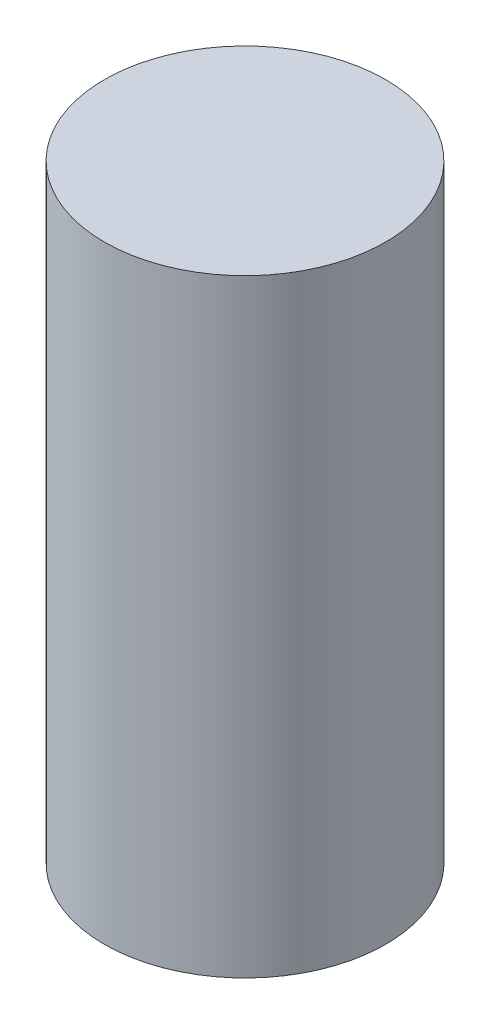
ISO-10303-21;
HEADER;
FILE_DESCRIPTION(('STEP AP214'),'2;1');
FILE_NAME('part.step','',(''),(''),'','','');
FILE_SCHEMA(('AUTOMOTIVE_DESIGN { 1 0 10303 214 1 1 1 1 }'));
ENDSEC;
DATA;
#1=APPLICATION_CONTEXT('core data for automotive mechanical design processes');
#2=APPLICATION_PROTOCOL_DEFINITION('international standard','automotive_design',2000,#1);
#3=PRODUCT_CONTEXT('',#1,'mechanical');
#4=PRODUCT('Part','Part','',(#3));
#5=PRODUCT_RELATED_PRODUCT_CATEGORY('part','',(#4));
#6=PRODUCT_DEFINITION_FORMATION('','',#4);
#7=PRODUCT_DEFINITION_CONTEXT('part definition',#1,'design');
#8=PRODUCT_DEFINITION('design','',#6,#7);
#9=PRODUCT_DEFINITION_SHAPE('','',#8);
#10=(LENGTH_UNIT() NAMED_UNIT(*) SI_UNIT(.MILLI.,.METRE.));
#11=(NAMED_UNIT(*) PLANE_ANGLE_UNIT() SI_UNIT($,.RADIAN.));
#12=(NAMED_UNIT(*) SI_UNIT($,.STERADIAN.) SOLID_ANGLE_UNIT());
#13=UNCERTAINTY_MEASURE_WITH_UNIT(LENGTH_MEASURE(1.E-05),#10,'distance_accuracy_value','');
#14=(GEOMETRIC_REPRESENTATION_CONTEXT(3) GLOBAL_UNCERTAINTY_ASSIGNED_CONTEXT((#13)) GLOBAL_UNIT_ASSIGNED_CONTEXT((#10,
#11,#12)) REPRESENTATION_CONTEXT('',''));
#15=CARTESIAN_POINT('',(0.,0.,0.));
#16=DIRECTION('',(0.,0.,1.));
#17=DIRECTION('',(1.,0.,0.));
#18=AXIS2_PLACEMENT_3D('',#15,#16,#17);
#19=CARTESIAN_POINT('',(0.,29.4,0.));
#20=DIRECTION('',(0.,-1.,0.));
#21=DIRECTION('',(0.,0.,-1.));
#22=AXIS2_PLACEMENT_3D('',#19,#20,#21);
#23=CYLINDRICAL_SURFACE('',#22,6.8);
#24=CARTESIAN_POINT('',(0.,29.4,0.));
#25=DIRECTION('',(0.,1.,0.));
#26=DIRECTION('',(0.,0.,1.));
#27=AXIS2_PLACEMENT_3D('',#24,#25,#26);
#28=CIRCLE('',#27,6.8);
#29=CARTESIAN_POINT('',(0.,29.4,6.8));
#30=VERTEX_POINT('',#29);
#31=EDGE_CURVE('E10',#30,#30,#28,.T.);
#32=ORIENTED_EDGE('',*,*,#31,.F.);
#33=EDGE_LOOP('',(#32));
#34=FACE_BOUND('',#33,.T.);
#35=CARTESIAN_POINT('',(0.,0.,0.));
#36=DIRECTION('',(0.,1.,0.));
#37=DIRECTION('',(0.,0.,1.));
#38=AXIS2_PLACEMENT_3D('',#35,#36,#37);
#39=CIRCLE('',#38,6.8);
#40=CARTESIAN_POINT('',(0.,0.,6.8));
#41=VERTEX_POINT('',#40);
#42=EDGE_CURVE('E34',#41,#41,#39,.T.);
#43=ORIENTED_EDGE('',*,*,#42,.T.);
#44=EDGE_LOOP('',(#43));
#45=FACE_BOUND('',#44,.T.);
#46=ADVANCED_FACE('F31',(#34,#45),#23,.T.);
#47=CARTESIAN_POINT('',(0.,29.4,0.));
#48=DIRECTION('',(0.,1.,0.));
#49=DIRECTION('',(0.,0.,1.));
#50=AXIS2_PLACEMENT_3D('',#47,#48,#49);
#51=PLANE('',#50);
#52=ORIENTED_EDGE('',*,*,#31,.T.);
#53=EDGE_LOOP('',(#52));
#54=FACE_BOUND('',#53,.T.);
#55=ADVANCED_FACE('F46',(#54),#51,.T.);
#56=CARTESIAN_POINT('',(0.,0.,0.));
#57=DIRECTION('',(0.,1.,0.));
#58=DIRECTION('',(0.,0.,1.));
#59=AXIS2_PLACEMENT_3D('',#56,#57,#58);
#60=PLANE('',#59);
#61=ORIENTED_EDGE('',*,*,#42,.F.);
#62=EDGE_LOOP('',(#61));
#63=FACE_BOUND('',#62,.T.);
#64=ADVANCED_FACE('F44',(#63),#60,.F.);
#65=CLOSED_SHELL('',(#46,#55,#64));
#66=MANIFOLD_SOLID_BREP('B2',#65);
#67=ADVANCED_BREP_SHAPE_REPRESENTATION('',(#18,#66),#14);
#68=SHAPE_DEFINITION_REPRESENTATION(#9,#67);
ENDSEC;
END-ISO-10303-21;
